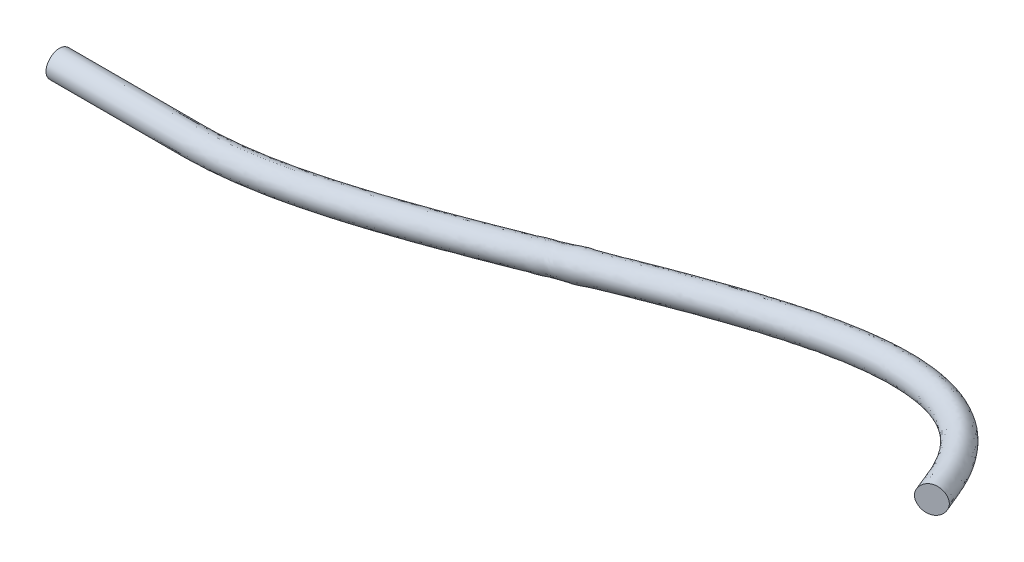
ISO-10303-21;
HEADER;
FILE_DESCRIPTION(('STEP AP214'),'2;1');
FILE_NAME('part.step','',(''),(''),'','','');
FILE_SCHEMA(('AUTOMOTIVE_DESIGN { 1 0 10303 214 1 1 1 1 }'));
ENDSEC;
DATA;
#1=APPLICATION_CONTEXT('core data for automotive mechanical design processes');
#2=APPLICATION_PROTOCOL_DEFINITION('international standard','automotive_design',2000,#1);
#3=PRODUCT_CONTEXT('',#1,'mechanical');
#4=PRODUCT('Part','Part','',(#3));
#5=PRODUCT_RELATED_PRODUCT_CATEGORY('part','',(#4));
#6=PRODUCT_DEFINITION_FORMATION('','',#4);
#7=PRODUCT_DEFINITION_CONTEXT('part definition',#1,'design');
#8=PRODUCT_DEFINITION('design','',#6,#7);
#9=PRODUCT_DEFINITION_SHAPE('','',#8);
#10=(LENGTH_UNIT() NAMED_UNIT(*) SI_UNIT(.MILLI.,.METRE.));
#11=(NAMED_UNIT(*) PLANE_ANGLE_UNIT() SI_UNIT($,.RADIAN.));
#12=(NAMED_UNIT(*) SI_UNIT($,.STERADIAN.) SOLID_ANGLE_UNIT());
#13=UNCERTAINTY_MEASURE_WITH_UNIT(LENGTH_MEASURE(1.E-05),#10,'distance_accuracy_value','');
#14=(GEOMETRIC_REPRESENTATION_CONTEXT(3) GLOBAL_UNCERTAINTY_ASSIGNED_CONTEXT((#13)) GLOBAL_UNIT_ASSIGNED_CONTEXT((#10,
#11,#12)) REPRESENTATION_CONTEXT('',''));
#15=CARTESIAN_POINT('',(0.,0.,0.));
#16=DIRECTION('',(0.,0.,1.));
#17=DIRECTION('',(1.,0.,0.));
#18=AXIS2_PLACEMENT_3D('',#15,#16,#17);
#19=CARTESIAN_POINT('',(-82.6299399470832,0.,-8.));
#20=DIRECTION('',(1.,0.,0.));
#21=DIRECTION('',(0.,0.,-1.));
#22=AXIS2_PLACEMENT_3D('',#19,#20,#21);
#23=PLANE('',#22);
#24=CARTESIAN_POINT('',(-82.6299399470832,1.24999999999999,-8.));
#25=CARTESIAN_POINT('',(-82.6299399470832,1.24999451104967,-7.934263445998));
#26=CARTESIAN_POINT('',(-82.6299399470832,1.24394757093799,-7.86843978532755));
#27=CARTESIAN_POINT('',(-82.6299399470832,1.22054770115747,-7.73875269022428));
#28=CARTESIAN_POINT('',(-82.6299399470832,1.20316461418978,-7.67489496159666));
#29=CARTESIAN_POINT('',(-82.6299399470832,1.15846921996212,-7.55120616587918));
#30=CARTESIAN_POINT('',(-82.6299399470832,1.13121529819942,-7.49135382383757));
#31=CARTESIAN_POINT('',(-82.6299399470832,1.06805297644656,-7.37647331966041));
#32=CARTESIAN_POINT('',(-82.6299399470832,1.03214728036355,-7.32144365762356));
#33=CARTESIAN_POINT('',(-82.6299399470832,0.948477668569165,-7.21142859876297));
#34=CARTESIAN_POINT('',(-82.6299399470832,0.899848374441609,-7.15710012899909));
#35=CARTESIAN_POINT('',(-82.6299399470832,0.794666340037271,-7.05674302691352));
#36=CARTESIAN_POINT('',(-82.6299399470832,0.7381121943317,-7.01071587010256));
#37=CARTESIAN_POINT('',(-82.6299399470832,0.614504613297751,-6.92574363106526));
#38=CARTESIAN_POINT('',(-82.6299399470832,0.547013815945937,-6.88742881801773));
#39=CARTESIAN_POINT('',(-82.6299399470832,0.406202269758556,-6.82377361348313));
#40=CARTESIAN_POINT('',(-82.6299399470832,0.332888504250432,-6.79841794399412));
#41=CARTESIAN_POINT('',(-82.6299399470832,0.188529507754825,-6.76413916117621));
#42=CARTESIAN_POINT('',(-82.6299399470832,0.117763565612033,-6.75407485213505));
#43=CARTESIAN_POINT('',(-82.6299399470832,0.0112594270703022,-6.74947851287114));
#44=CARTESIAN_POINT('',(-82.6299399470832,-0.0243064185035648,-6.74969722601773));
#45=CARTESIAN_POINT('',(-82.6299399470832,-0.0952474387330563,-6.75360385843807));
#46=CARTESIAN_POINT('',(-82.6299399470832,-0.130622610620301,-6.75729182794601));
#47=CARTESIAN_POINT('',(-82.6299399470832,-0.227246675883381,-6.77202546039026));
#48=CARTESIAN_POINT('',(-82.6299399470832,-0.287995438922519,-6.78651537263959));
#49=CARTESIAN_POINT('',(-82.6299399470832,-0.406494949751201,-6.82471336535006));
#50=CARTESIAN_POINT('',(-82.6299399470832,-0.464243700938894,-6.84842749793658));
#51=CARTESIAN_POINT('',(-82.6299399470832,-0.580107662982173,-6.90617945028038));
#52=CARTESIAN_POINT('',(-82.6299399470832,-0.637888674449695,-6.94088689234426));
#53=CARTESIAN_POINT('',(-82.6299399470832,-0.747643557595564,-7.0184851145213));
#54=CARTESIAN_POINT('',(-82.6299399470832,-0.799615981007491,-7.06137792832326));
#55=CARTESIAN_POINT('',(-82.6299399470832,-0.902666862391156,-7.15988937616232));
#56=CARTESIAN_POINT('',(-82.6299399470832,-0.952879103379935,-7.21641933669692));
#57=CARTESIAN_POINT('',(-82.6299399470832,-1.04333787829117,-7.33706089542942));
#58=CARTESIAN_POINT('',(-82.6299399470832,-1.08357285603768,-7.40118115933771));
#59=CARTESIAN_POINT('',(-82.6299399470832,-1.1526842444095,-7.53641454182478));
#60=CARTESIAN_POINT('',(-82.6299399470832,-1.18141371043898,-7.60760447411582));
#61=CARTESIAN_POINT('',(-82.6299399470832,-1.21384481273303,-7.71731529623764));
#62=CARTESIAN_POINT('',(-82.6299399470832,-1.22287305316677,-7.75432217075763));
#63=CARTESIAN_POINT('',(-82.6299399470832,-1.23718702602298,-7.8290422018503));
#64=CARTESIAN_POINT('',(-82.6299399470832,-1.24247612133089,-7.86675469239093));
#65=CARTESIAN_POINT('',(-82.6299399470832,-1.24767209857493,-7.92587702995989));
#66=CARTESIAN_POINT('',(-82.6299399470832,-1.24892231043038,-7.94717897562707));
#67=CARTESIAN_POINT('',(-82.6299399470832,-1.25048636683131,-8.00107627368345));
#68=CARTESIAN_POINT('',(-82.6299399470832,-1.24995845079837,-8.03370175854709));
#69=CARTESIAN_POINT('',(-82.6299399470832,-1.24598903524944,-8.09878128897267));
#70=CARTESIAN_POINT('',(-82.6299399470832,-1.24254568787251,-8.13123521266514));
#71=CARTESIAN_POINT('',(-82.6299399470832,-1.22797265850684,-8.22811692438643));
#72=CARTESIAN_POINT('',(-82.6299399470832,-1.21259724132503,-8.29194935427683));
#73=CARTESIAN_POINT('',(-82.6299399470832,-1.17184541654786,-8.4158326725357));
#74=CARTESIAN_POINT('',(-82.6299399470832,-1.14652834432506,-8.47590358879103));
#75=CARTESIAN_POINT('',(-82.6299399470832,-1.08716532643699,-8.59150617962943));
#76=CARTESIAN_POINT('',(-82.6299399470832,-1.05312277209196,-8.64703960675751));
#77=CARTESIAN_POINT('',(-82.6299399470832,-0.973392709346968,-8.75827792740005));
#78=CARTESIAN_POINT('',(-82.6299399470832,-0.926851008522067,-8.81337087903084));
#79=CARTESIAN_POINT('',(-82.6299399470832,-0.825780898101187,-8.91567364115991));
#80=CARTESIAN_POINT('',(-82.6299399470832,-0.771250375430304,-8.96288135889058));
#81=CARTESIAN_POINT('',(-82.6299399470832,-0.651061071680257,-9.0512823600046));
#82=CARTESIAN_POINT('',(-82.6299399470832,-0.584876109509526,-9.09176649095456));
#83=CARTESIAN_POINT('',(-82.6299399470832,-0.446316510741809,-9.16016458558048));
#84=CARTESIAN_POINT('',(-82.6299399470832,-0.373947149962019,-9.18808913873786));
#85=CARTESIAN_POINT('',(-82.6299399470832,-0.229997495672789,-9.22791910991847));
#86=CARTESIAN_POINT('',(-82.6299399470832,-0.158685599411071,-9.24076747249703));
#87=CARTESIAN_POINT('',(-82.6299399470832,-0.0509714093887163,-9.2493928006905));
#88=CARTESIAN_POINT('',(-82.6299399470832,-0.0149420274589847,-9.25049334386473));
#89=CARTESIAN_POINT('',(-82.6299399470832,0.0570464947861916,-9.24909641718269));
#90=CARTESIAN_POINT('',(-82.6299399470832,0.0930056383961135,-9.24659912034591));
#91=CARTESIAN_POINT('',(-82.6299399470832,0.190865207567188,-9.23499950409096));
#92=CARTESIAN_POINT('',(-82.6299399470832,0.252375177695036,-9.22238819569572));
#93=CARTESIAN_POINT('',(-82.6299399470832,0.372618660830394,-9.1876324322482));
#94=CARTESIAN_POINT('',(-82.6299399470832,0.431350040636321,-9.16548078051185));
#95=CARTESIAN_POINT('',(-82.6299399470832,0.548309093036346,-9.11118017114085));
#96=CARTESIAN_POINT('',(-82.6299399470832,0.606294201026917,-9.07851023861039));
#97=CARTESIAN_POINT('',(-82.6299399470832,0.716782227147695,-9.00497270761376));
#98=CARTESIAN_POINT('',(-82.6299399470832,0.769284126532467,-8.96410358989634));
#99=CARTESIAN_POINT('',(-82.6299399470832,0.874110904698241,-8.86962192185421));
#100=CARTESIAN_POINT('',(-82.6299399470832,0.925576562838173,-8.81505192123485));
#101=CARTESIAN_POINT('',(-82.6299399470832,1.01899120100739,-8.69817964883807));
#102=CARTESIAN_POINT('',(-82.6299399470832,1.06092922861801,-8.63586860435206));
#103=CARTESIAN_POINT('',(-82.6299399470832,1.13449301587409,-8.50327539966568));
#104=CARTESIAN_POINT('',(-82.6299399470832,1.16582552688828,-8.43282933746418));
#105=CARTESIAN_POINT('',(-82.6299399470832,1.21449053501966,-8.28738644572588));
#106=CARTESIAN_POINT('',(-82.6299399470832,1.23187536123434,-8.21240777174639));
#107=CARTESIAN_POINT('',(-82.6299399470832,1.24425522575055,-8.11391843014801));
#108=CARTESIAN_POINT('',(-82.6299399470832,1.24640193487613,-8.09119081010386));
#109=CARTESIAN_POINT('',(-82.6299399470832,1.2492752517605,-8.0456456262251));
#110=CARTESIAN_POINT('',(-82.6299399470832,1.25000190612542,-8.02282806536697));
#111=CARTESIAN_POINT('',(-82.6299399470832,1.24999999999999,-8.));
#112=B_SPLINE_CURVE_WITH_KNOTS('',3,(#24,#25,#26,#27,#28,#29,#30,#31,#32,#33,#34,#35,#36,#37,
#38,#39,#40,#41,#42,#43,#44,#45,#46,#47,#48,#49,#50,#51,#52,#53,#54,#55,#56,#57,#58,#59,#60,#61,
#62,#63,#64,#65,#66,#67,#68,#69,#70,#71,#72,#73,#74,#75,#76,#77,#78,#79,#80,#81,#82,#83,#84,#85,
#86,#87,#88,#89,#90,#91,#92,#93,#94,#95,#96,#97,#98,#99,#100,#101,#102,#103,#104,#105,#106,#107,
#108,#109,#110,#111),.UNSPECIFIED.,.T.,.F.,(4,2,2,2,2,2,2,2,2,2,2,2,2,2,2,2,2,2,2,2,2,2,2,2,2,2,
2,2,2,2,2,2,2,2,2,2,2,2,2,2,2,2,2,4),(0.,0.197116879760725,0.394760296143589,0.591253259525333,
0.78768489315266,1.00549973727618,1.22335325866559,1.4549555018158,1.68628406722216,
1.89931405653623,2.00586042536824,2.11240833699586,2.29889416315246,2.4855025519213,
2.68691126080963,2.88837007581244,3.11416228610467,3.34021481159209,3.5690687754045,
3.68319318615433,3.7972148254841,3.86120286479425,3.95894310699971,4.05674534541567,
4.25269104555643,4.44748462437225,4.64220260755968,4.85766355141401,5.07318158877794,
5.30474023035866,5.53610326792274,5.75205882159631,5.86003814673477,5.96801227933965,
6.1554726305271,6.3430746393393,6.54195533500427,6.74087291595324,6.96490444465314,
7.1891922185423,7.41925360779743,7.64844775970474,7.71690198239458,7.78535395838307),.UNSPECIFIED.);
#113=CARTESIAN_POINT('',(-82.6299399470832,1.24999999999999,-8.));
#114=VERTEX_POINT('',#113);
#115=EDGE_CURVE('E28',#114,#114,#112,.T.);
#116=ORIENTED_EDGE('',*,*,#115,.F.);
#117=EDGE_LOOP('',(#116));
#118=FACE_BOUND('',#117,.T.);
#119=ADVANCED_FACE('F15',(#118),#23,.F.);
#120=CARTESIAN_POINT('',(-4.97488462074198,1.5,-12.0104339226486));
#121=DIRECTION('',(0.382683432365065,0.,0.923879532511297));
#122=DIRECTION('',(0.923879532511297,0.,-0.382683432365065));
#123=AXIS2_PLACEMENT_3D('',#120,#121,#122);
#124=PLANE('',#123);
#125=CARTESIAN_POINT('',(-4.96027339280794,2.74989081560263,-12.0164860914218));
#126=CARTESIAN_POINT('',(-4.89976415622547,2.74914926909641,-12.0415498378631));
#127=CARTESIAN_POINT('',(-4.839239547017,2.74241022652978,-12.0666199518546));
#128=CARTESIAN_POINT('',(-4.72008853566718,2.71767071582545,-12.1159739167262));
#129=CARTESIAN_POINT('',(-4.66146836227079,2.69963657665579,-12.1402551875756));
#130=CARTESIAN_POINT('',(-4.5480503043085,2.65370613180203,-12.1872344854016));
#131=CARTESIAN_POINT('',(-4.49323185547633,2.62586881235953,-12.2099410303761));
#132=CARTESIAN_POINT('',(-4.38813525175894,2.56162062563925,-12.2534734689952));
#133=CARTESIAN_POINT('',(-4.33785533947212,2.52521309677129,-12.2743000905794));
#134=CARTESIAN_POINT('',(-4.23748709669935,2.44061810372065,-12.3158739779674));
#135=CARTESIAN_POINT('',(-4.18800813721481,2.3915822812109,-12.336368834038));
#136=CARTESIAN_POINT('',(-4.09673150553609,2.28574455131122,-12.3741768528071));
#137=CARTESIAN_POINT('',(-4.05493546617023,2.22894099753142,-12.3914893391659));
#138=CARTESIAN_POINT('',(-3.97772493911392,2.10473128572356,-12.4234709866306));
#139=CARTESIAN_POINT('',(-3.94293211903832,2.03686814615665,-12.4378826445791));
#140=CARTESIAN_POINT('',(-3.88531365016109,1.89545702002494,-12.4617489958312));
#141=CARTESIAN_POINT('',(-3.86247539271455,1.82191511728978,-12.4712089118065));
#142=CARTESIAN_POINT('',(-3.83181062449372,1.67689646049935,-12.4839106746906));
#143=CARTESIAN_POINT('',(-3.8229937809974,1.60567304607789,-12.4875627308441));
#144=CARTESIAN_POINT('',(-3.81953605474406,1.4985693450428,-12.4889949679532));
#145=CARTESIAN_POINT('',(-3.82001190113379,1.4628200107549,-12.488797865925));
#146=CARTESIAN_POINT('',(-3.82421343937108,1.39154570024958,-12.4870575318043));
#147=CARTESIAN_POINT('',(-3.82793910585535,1.35602072228334,-12.4855143102176));
#148=CARTESIAN_POINT('',(-3.84245212693226,1.25925414384471,-12.4795028200566));
#149=CARTESIAN_POINT('',(-3.85643133536663,1.19854817552451,-12.4737124423318));
#150=CARTESIAN_POINT('',(-3.8929507006491,1.08025708794606,-12.4585856259426));
#151=CARTESIAN_POINT('',(-3.91549680721039,1.02267416947951,-12.4492467228262));
#152=CARTESIAN_POINT('',(-3.97000496774041,0.907682948482515,-12.4266687034746));
#153=CARTESIAN_POINT('',(-4.00252940912379,0.850587541275613,-12.413196638745));
#154=CARTESIAN_POINT('',(-4.07502603025172,0.742258466378721,-12.3831675550476));
#155=CARTESIAN_POINT('',(-4.11499993027247,0.691026157052202,-12.3666098235181));
#156=CARTESIAN_POINT('',(-4.20670082780987,0.589455267965675,-12.3286260680763));
#157=CARTESIAN_POINT('',(-4.25926873248316,0.540002001086894,-12.3068517290151));
#158=CARTESIAN_POINT('',(-4.3712733173156,0.451056907458015,-12.2604579109295));
#159=CARTESIAN_POINT('',(-4.43071761313479,0.411576282506383,-12.2358352773955));
#160=CARTESIAN_POINT('',(-4.55614458660073,0.343743432986418,-12.1838817238985));
#161=CARTESIAN_POINT('',(-4.62222350219324,0.315598105526852,-12.1565109408732));
#162=CARTESIAN_POINT('',(-4.75801547109453,0.273549970128643,-12.1002640656929));
#163=CARTESIAN_POINT('',(-4.82771294265216,0.25959068305705,-12.0713944277106));
#164=CARTESIAN_POINT('',(-4.91495356656513,0.252047485025046,-12.035258178096));
#165=CARTESIAN_POINT('',(-4.9320708764728,0.251038299865113,-12.0281679561809));
#166=CARTESIAN_POINT('',(-4.96633119090965,0.249962288201005,-12.01397686929));
#167=CARTESIAN_POINT('',(-4.98347419525295,0.249895454912508,-12.0068760043912));
#168=CARTESIAN_POINT('',(-5.06132153022488,0.251779511361305,-11.9746305824512));
#169=CARTESIAN_POINT('',(-5.12199357420015,0.259290834238215,-11.9494993989797));
#170=CARTESIAN_POINT('',(-5.24130052452541,0.285572752485075,-11.9000808420697));
#171=CARTESIAN_POINT('',(-5.29992914637272,0.304375309165862,-11.8757960717573));
#172=CARTESIAN_POINT('',(-5.4132598002729,0.351817854368603,-11.8288529778792));
#173=CARTESIAN_POINT('',(-5.46798290594936,0.38039931040431,-11.8061859253328));
#174=CARTESIAN_POINT('',(-5.57279216570636,0.446105883037905,-11.7627725084792));
#175=CARTESIAN_POINT('',(-5.62287997119789,0.483227940330179,-11.7420254601351));
#176=CARTESIAN_POINT('',(-5.72277201442856,0.569326945947953,-11.7006488210558));
#177=CARTESIAN_POINT('',(-5.77195155591433,0.619154590947568,-11.6802779879811));
#178=CARTESIAN_POINT('',(-5.86248138436063,0.726546450568742,-11.6427793052393));
#179=CARTESIAN_POINT('',(-5.90383027715104,0.784112039741792,-11.6256520330564));
#180=CARTESIAN_POINT('',(-5.97977063083461,0.909582181702379,-11.5941965086293));
#181=CARTESIAN_POINT('',(-6.01377093126964,0.977909953075727,-11.5801131230644));
#182=CARTESIAN_POINT('',(-6.06966760774206,1.12010478247088,-11.5569599615779));
#183=CARTESIAN_POINT('',(-6.09157826611371,1.19396518668885,-11.5478842697198));
#184=CARTESIAN_POINT('',(-6.12026838914593,1.33905196747036,-11.5360004316537));
#185=CARTESIAN_POINT('',(-6.12810765603747,1.4100245529746,-11.5327533009882));
#186=CARTESIAN_POINT('',(-6.13016080863225,1.51660464942211,-11.5319028573378));
#187=CARTESIAN_POINT('',(-6.12922671417907,1.55215680432518,-11.5322897719289));
#188=CARTESIAN_POINT('',(-6.12415811515207,1.62299319738925,-11.5343892543881));
#189=CARTESIAN_POINT('',(-6.12002356423298,1.65827743166306,-11.5361018414531));
#190=CARTESIAN_POINT('',(-6.10442593819459,1.75454931541005,-11.542562589699));
#191=CARTESIAN_POINT('',(-6.0897918686002,1.81496022027623,-11.5486242197977));
#192=CARTESIAN_POINT('',(-6.05207109644876,1.93257926857484,-11.564248675206));
#193=CARTESIAN_POINT('',(-6.02897885998411,1.98978528683644,-11.5738137927352));
#194=CARTESIAN_POINT('',(-5.97325147717589,2.10433349391368,-11.5968968304899));
#195=CARTESIAN_POINT('',(-5.94000474210711,2.16132666365742,-11.61066807906));
#196=CARTESIAN_POINT('',(-5.86607201365744,2.26932548242332,-11.6412920178871));
#197=CARTESIAN_POINT('',(-5.82538411062953,2.32032958892599,-11.6581454991458));
#198=CARTESIAN_POINT('',(-5.73227176818824,2.4211612055126,-11.6967138942093));
#199=CARTESIAN_POINT('',(-5.67902329712082,2.47010228416397,-11.7187701331011));
#200=CARTESIAN_POINT('',(-5.56573044703065,2.55785040881986,-11.7656975681283));
#201=CARTESIAN_POINT('',(-5.50567853840328,2.59664606635605,-11.7905718831282));
#202=CARTESIAN_POINT('',(-5.37935292571082,2.66272449400189,-11.8428976651805));
#203=CARTESIAN_POINT('',(-5.31301156423653,2.68985922194648,-11.8703771568494));
#204=CARTESIAN_POINT('',(-5.21101338491705,2.71983854012591,-11.9126261860609));
#205=CARTESIAN_POINT('',(-5.17664535724554,2.72804083395768,-11.9268618892345));
#206=CARTESIAN_POINT('',(-5.10733158257879,2.74068757282284,-11.9555725947607));
#207=CARTESIAN_POINT('',(-5.07238632828716,2.74513506934826,-11.9700473930289));
#208=CARTESIAN_POINT('',(-5.01168646982198,2.74943834004976,-11.9951900976393));
#209=CARTESIAN_POINT('',(-4.98598131873767,2.75020586870414,-12.0058375198412));
#210=CARTESIAN_POINT('',(-4.96027339280794,2.74989081560263,-12.0164860914218));
#211=B_SPLINE_CURVE_WITH_KNOTS('',3,(#125,#126,#127,#128,#129,#130,#131,#132,#133,#134,#135,
#136,#137,#138,#139,#140,#141,#142,#143,#144,#145,#146,#147,#148,#149,#150,#151,#152,#153,#154,
#155,#156,#157,#158,#159,#160,#161,#162,#163,#164,#165,#166,#167,#168,#169,#170,#171,#172,#173,
#174,#175,#176,#177,#178,#179,#180,#181,#182,#183,#184,#185,#186,#187,#188,#189,#190,#191,#192,
#193,#194,#195,#196,#197,#198,#199,#200,#201,#202,#203,#204,#205,#206,#207,#208,#209,#210),
.UNSPECIFIED.,.T.,.F.,(4,2,2,2,2,2,2,2,2,2,2,2,2,2,2,2,2,2,2,2,2,2,2,2,2,2,2,2,2,2,2,2,2,2,2,2,
2,2,2,2,2,2,4),(0.,0.196397578991343,0.393383430196831,0.589203708083759,0.784947832675607,
1.00187152193737,1.21884126018193,1.45046511010116,1.681844168332,1.89601108021464,
2.0031144603967,2.11021700469568,2.29702137692428,2.48395572267383,2.6843893154749,
2.88486925115563,3.11001253414754,3.33540759652621,3.56474813837072,3.79317198263352,
3.84882207068081,3.90447175808329,4.10157162661478,4.29923205936699,4.49572949614903,
4.69215665540574,4.90997146645888,5.12782502091781,5.35942752383239,5.59075582958414,
5.8037857562943,5.91033215647891,6.01688009957302,6.20336609181688,6.38997431445435,
6.59138219617579,6.79284183846234,7.01863801477581,7.24468657494353,7.47352576167356,
7.58765261845514,7.70168663577659,7.78512801925206),.UNSPECIFIED.);
#212=CARTESIAN_POINT('',(-4.96027339280794,2.74989081560263,-12.0164860914218));
#213=VERTEX_POINT('',#212);
#214=EDGE_CURVE('E10',#213,#213,#211,.T.);
#215=ORIENTED_EDGE('',*,*,#214,.F.);
#216=EDGE_LOOP('',(#215));
#217=FACE_BOUND('',#216,.T.);
#218=ADVANCED_FACE('F36',(#217),#124,.T.);
#219=CARTESIAN_POINT('',(-82.6299399470832,1.24999999999999,-8.));
#220=CARTESIAN_POINT('',(-78.4673130379324,1.24999999999999,-8.));
#221=CARTESIAN_POINT('',(-74.1429598139041,1.24999784413656,-8.00170386651195));
#222=CARTESIAN_POINT('',(-64.5499802448411,1.25000299765051,-7.99763083493473));
#223=CARTESIAN_POINT('',(-58.32276354188,1.34931283873836,-9.68253438955358));
#224=CARTESIAN_POINT('',(-50.3254511622084,1.52256147322456,-12.243982642926));
#225=CARTESIAN_POINT('',(-48.7182612785638,1.56182502129807,-12.7870872204025));
#226=CARTESIAN_POINT('',(-46.2781720158321,1.60922003642585,-13.5372494840847));
#227=CARTESIAN_POINT('',(-45.4677031631818,1.63862504790368,-13.7969954784039));
#228=CARTESIAN_POINT('',(-44.1762331975424,1.58362935185705,-13.9796088930681));
#229=CARTESIAN_POINT('',(-43.7292604588893,1.61767208159078,-13.9900739999033));
#230=CARTESIAN_POINT('',(-42.9594433142138,1.11213015310007,-13.7695942287284));
#231=CARTESIAN_POINT('',(-42.6859372215601,0.744156978901234,-13.6638184209571));
#232=CARTESIAN_POINT('',(-42.2907018019852,-0.0292629482295288,-13.8762720028818));
#233=CARTESIAN_POINT('',(-42.1530435971104,-0.283201742010382,-14.1388344441783));
#234=CARTESIAN_POINT('',(-41.3640803369761,-0.908158093879505,-15.1209385778716));
#235=CARTESIAN_POINT('',(-40.5760269401968,-0.678438105024769,-15.4077877376587));
#236=CARTESIAN_POINT('',(-39.0358514318827,-0.663161966181277,-16.0877630210618));
#237=CARTESIAN_POINT('',(-38.2569731412143,-0.643369177418067,-16.3889764199555));
#238=CARTESIAN_POINT('',(-35.930369349776,-0.584139893720942,-17.2644087558491));
#239=CARTESIAN_POINT('',(-34.3890589289272,-0.538835001947949,-17.7998471070783));
#240=CARTESIAN_POINT('',(-26.8203196817,-0.314260161888173,-20.2780073639864));
#241=CARTESIAN_POINT('',(-21.1423642902392,-0.128817369778011,-21.6267168256903));
#242=CARTESIAN_POINT('',(-14.0504123208268,0.0819660689236484,-21.1327818241657));
#243=CARTESIAN_POINT('',(-11.9244313728403,0.141323746897592,-20.5428117137421));
#244=CARTESIAN_POINT('',(-8.31951094026181,0.225381060992211,-18.1871627239197));
#245=CARTESIAN_POINT('',(-6.83323165674978,0.250319048288096,-16.4227931876634));
#246=CARTESIAN_POINT('',(-5.5203653280615,0.250308263514492,-13.2548680971591));
#247=CARTESIAN_POINT('',(-5.25533503430871,0.250310281170427,-12.6147263010424));
#248=CARTESIAN_POINT('',(-5.00061440284024,0.250310281170211,-11.9997762979466));
#249=CARTESIAN_POINT('',(-82.6299399470832,1.24999999999999,-7.34550153050212));
#250=CARTESIAN_POINT('',(-78.4307901746025,1.24999999999999,-7.34550153050212));
#251=CARTESIAN_POINT('',(-74.1915887344148,1.25090933391794,-7.3472044975582));
#252=CARTESIAN_POINT('',(-64.482363480953,1.24873560391265,-7.34313361609789));
#253=CARTESIAN_POINT('',(-58.1417044323906,1.35398436871358,-9.05226932167524));
#254=CARTESIAN_POINT('',(-50.1136840509845,1.48816690381801,-11.6255618089751));
#255=CARTESIAN_POINT('',(-48.501882071257,1.52077889097471,-12.1696153960085));
#256=CARTESIAN_POINT('',(-46.0587338924115,1.51257273902406,-12.9279659338611));
#257=CARTESIAN_POINT('',(-45.24541379231,1.52728295525352,-13.1838202651168));
#258=CARTESIAN_POINT('',(-43.9651448247779,1.33395731080393,-13.410548162771));
#259=CARTESIAN_POINT('',(-43.5120689771814,1.29399181982901,-13.4101629823077));
#260=CARTESIAN_POINT('',(-42.8287359567967,0.543438836933819,-13.4489054983599));
#261=CARTESIAN_POINT('',(-42.618998389974,0.0748890251134603,-13.5280056983189));
#262=CARTESIAN_POINT('',(-42.3635888464237,-0.663953097500539,-14.1266747361293));
#263=CARTESIAN_POINT('',(-42.2743953188778,-0.812977162628285,-14.5161691536623));
#264=CARTESIAN_POINT('',(-41.6090102471717,-1.09400221281749,-15.8168297006204));
#265=CARTESIAN_POINT('',(-40.7835870867088,-0.862373959682668,-16.0015553024204));
#266=CARTESIAN_POINT('',(-39.2481680999386,-0.782415061811523,-16.6961821752883));
#267=CARTESIAN_POINT('',(-38.4686915774094,-0.749858219550985,-16.9991580261462));
#268=CARTESIAN_POINT('',(-36.1389895901971,-0.658764375190916,-17.8806464226742));
#269=CARTESIAN_POINT('',(-34.5926845868728,-0.606625304249534,-18.4182350459236));
#270=CARTESIAN_POINT('',(-26.9890745454449,-0.351328831349457,-20.9104828466961));
#271=CARTESIAN_POINT('',(-21.2573288286086,-0.166746798737893,-22.2901154064621));
#272=CARTESIAN_POINT('',(-13.9225468809217,0.0545997834607554,-21.7792073737249));
#273=CARTESIAN_POINT('',(-11.6795237396379,0.117993772080195,-21.1643141930278));
#274=CARTESIAN_POINT('',(-7.84748930868401,0.20851269929624,-18.6601324961522));
#275=CARTESIAN_POINT('',(-6.24968259868227,0.235495762936977,-16.7238251832281));
#276=CARTESIAN_POINT('',(-4.91100969330965,0.235781698068551,-13.4936200659266));
#277=CARTESIAN_POINT('',(-4.65443234329321,0.23572820425566,-12.8738812604926));
#278=CARTESIAN_POINT('',(-4.39608675890461,0.235728204255441,-12.2501798468942));
#279=CARTESIAN_POINT('',(-82.6299399470832,0.654498469497868,-6.75));
#280=CARTESIAN_POINT('',(-78.3956253974687,0.654498469497179,-6.75));
#281=CARTESIAN_POINT('',(-74.2384094104545,0.65623712782756,-6.75087272597686));
#282=CARTESIAN_POINT('',(-64.4172610159258,0.652080927662139,-6.74878650593727));
#283=CARTESIAN_POINT('',(-57.9648827033473,0.762151473410816,-8.4778146361595));
#284=CARTESIAN_POINT('',(-49.9186826669691,0.862294967682176,-11.0967463315393));
#285=CARTESIAN_POINT('',(-48.3043449442196,0.888288247048973,-11.6475962816589));
#286=CARTESIAN_POINT('',(-45.8752388870319,0.835592277084756,-12.4612192491517));
#287=CARTESIAN_POINT('',(-45.0636187535443,0.832728425284576,-12.726224750739));
#288=CARTESIAN_POINT('',(-43.8369826065098,0.55475205061938,-13.1112841058076));
#289=CARTESIAN_POINT('',(-43.4008375845456,0.436285341035767,-13.16452774559));
#290=CARTESIAN_POINT('',(-42.8775809574828,-0.288703988543581,-13.6468390923137));
#291=CARTESIAN_POINT('',(-42.7610991487451,-0.670900757271206,-13.9787586127489));
#292=CARTESIAN_POINT('',(-42.6312019225728,-1.00468099895085,-14.8959998842968));
#293=CARTESIAN_POINT('',(-42.5567480408878,-0.934688688542331,-15.3100666859237));
#294=CARTESIAN_POINT('',(-41.9053385191164,-0.592095079563951,-16.6033279924198));
#295=CARTESIAN_POINT('',(-41.0430293943172,-0.457642801065943,-16.694343643662));
#296=CARTESIAN_POINT('',(-39.4924352202645,-0.304823502054097,-17.3468074023472));
#297=CARTESIAN_POINT('',(-38.7085430399966,-0.259323375349674,-17.6404719698252));
#298=CARTESIAN_POINT('',(-36.3663415787429,-0.134955674642618,-18.5002834207619));
#299=CARTESIAN_POINT('',(-34.8133479583629,-0.0762216999150894,-19.0341385255107));
#300=CARTESIAN_POINT('',(-27.1679400241455,0.209636060522251,-21.5141232997661));
#301=CARTESIAN_POINT('',(-21.3859931081699,0.392967353472692,-22.9256250580611));
#302=CARTESIAN_POINT('',(-13.8176237041881,0.624451134584883,-22.3953408089882));
#303=CARTESIAN_POINT('',(-11.4621320002167,0.691717198331678,-21.755840434451));
#304=CARTESIAN_POINT('',(-7.41200702325386,0.788428476045155,-19.1077639326673));
#305=CARTESIAN_POINT('',(-5.70738533222572,0.817357478005418,-17.0055644378087));
#306=CARTESIAN_POINT('',(-4.34411513013242,0.817919405352926,-13.7152916981385));
#307=CARTESIAN_POINT('',(-4.0956296965825,0.81781427788456,-13.1152165650715));
#308=CARTESIAN_POINT('',(-3.8337939499284,0.81781427788456,-12.483089154397));
#309=CARTESIAN_POINT('',(-82.6299399470832,-0.65449846949788,-6.75));
#310=CARTESIAN_POINT('',(-78.3913739497811,-0.654498469498569,-6.75));
#311=CARTESIAN_POINT('',(-74.2440700649816,-0.652759817891534,-6.74904953708328));
#312=CARTESIAN_POINT('',(-64.4093900795243,-0.656916001985037,-6.75132158447996));
#313=CARTESIAN_POINT('',(-57.9383216490592,-0.548124344336898,-8.47561178741372));
#314=CARTESIAN_POINT('',(-49.9135761526735,-0.444671297381288,-11.1711764760235));
#315=CARTESIAN_POINT('',(-48.3028886987352,-0.419923755912634,-11.7350677783494));
#316=CARTESIAN_POINT('',(-45.9107670515466,-0.459212330293704,-12.6538108478148));
#317=CARTESIAN_POINT('',(-45.1085861809796,-0.47131688904939,-12.946715247601));
#318=CARTESIAN_POINT('',(-43.9774405943007,-0.658707694278701,-13.5915806667945));
#319=CARTESIAN_POINT('',(-43.590718149517,-0.801714789929935,-13.7844086446075));
#320=CARTESIAN_POINT('',(-43.2463639209457,-0.980489470084588,-14.7233027036963));
#321=CARTESIAN_POINT('',(-43.2073344612909,-0.971716710726683,-15.2412029812529));
#322=CARTESIAN_POINT('',(-43.0736793822914,-0.484269019017795,-16.0862803553887));
#323=CARTESIAN_POINT('',(-42.9346959809354,-0.142677067109551,-16.3004967946261));
#324=CARTESIAN_POINT('',(-42.0668503258859,0.882856319592675,-16.9403806931956));
#325=CARTESIAN_POINT('',(-41.1982001402363,0.799885476048924,-17.0296556801164));
#326=CARTESIAN_POINT('',(-39.6047357061654,0.983496766569752,-17.5601357467524));
#327=CARTESIAN_POINT('',(-38.8123337468213,1.03191996373214,-17.8298078870284));
#328=CARTESIAN_POINT('',(-36.4488530579332,1.16569920501949,-18.6298582116397));
#329=CARTESIAN_POINT('',(-34.8911460722479,1.22526135655975,-19.1512059684637));
#330=CARTESIAN_POINT('',(-27.2236020220516,1.51685390173394,-21.5760597810141));
#331=CARTESIAN_POINT('',(-21.4388863911235,1.69915741027185,-22.9957683677849));
#332=CARTESIAN_POINT('',(-13.842718540066,1.93179790731572,-22.4568385057249));
#333=CARTESIAN_POINT('',(-11.4740893487161,1.99950272082612,-21.8130941648798));
#334=CARTESIAN_POINT('',(-7.39879837452212,2.09690243814687,-19.1457818596678));
#335=CARTESIAN_POINT('',(-5.68243703797763,2.12601873621145,-17.0228033416872));
#336=CARTESIAN_POINT('',(-4.31671163766783,2.12659389383689,-13.7250534906971));
#337=CARTESIAN_POINT('',(-4.06910749827743,2.12648629119868,-13.1273959208107));
#338=CARTESIAN_POINT('',(-3.80684978512227,2.12648629119868,-12.4942497928865));
#339=CARTESIAN_POINT('',(-82.6299399470832,-1.25000000000001,-7.34550153050212));
#340=CARTESIAN_POINT('',(-78.4226705076083,-1.25000000000001,-7.34550153050212));
#341=CARTESIAN_POINT('',(-74.2023997882268,-1.24909067892229,-7.34372246326296));
#342=CARTESIAN_POINT('',(-64.467331099701,-1.25126437823346,-7.34797525947222));
#343=CARTESIAN_POINT('',(-58.0909765553705,-1.14845810978947,-9.04806219042026));
#344=CARTESIAN_POINT('',(-50.1039313270831,-1.00795479465163,-11.7677129139052));
#345=CARTESIAN_POINT('',(-48.4991008472684,-0.977721991626875,-12.3366736489444));
#346=CARTESIAN_POINT('',(-46.1265876884206,-0.960321904205394,-13.2957887929631));
#347=CARTESIAN_POINT('',(-45.3312952525558,-0.96326013825138,-13.6049260948753));
#348=CARTESIAN_POINT('',(-44.2333998214258,-0.983580088918787,-14.3278470247472));
#349=CARTESIAN_POINT('',(-43.8747141433329,-1.07041426487031,-14.5940482927884));
#350=CARTESIAN_POINT('',(-43.5330595355529,-0.777774110423649,-15.5047995560819));
#351=CARTESIAN_POINT('',(-43.4712450592547,-0.499627126326832,-15.9390968378307));
#352=CARTESIAN_POINT('',(-43.2086585454801,0.329960571106695,-16.399942983809));
#353=CARTESIAN_POINT('',(-42.9962227135547,0.69965361181871,-16.4077513247059));
#354=CARTESIAN_POINT('',(-41.9174750761639,1.72294745913573,-16.4605529415552));
#355=CARTESIAN_POINT('',(-41.0799413815341,1.53932813688533,-16.6419541193771));
#356=CARTESIAN_POINT('',(-39.4626462292618,1.67809540663203,-17.1036093014549));
#357=CARTESIAN_POINT('',(-38.6669172258605,1.71623490224142,-17.3607629916778));
#358=CARTESIAN_POINT('',(-36.2965749075102,1.82530346506662,-18.1281160442961));
#359=CARTESIAN_POINT('',(-34.7412680395559,1.87902423721041,-18.6418173925645));
#360=CARTESIAN_POINT('',(-27.0953811306474,2.14527334217114,-21.0287728125256));
#361=CARTESIAN_POINT('',(-21.3583475579538,2.32789245114605,-22.4240792600495));
#362=CARTESIAN_POINT('',(-13.9704744869923,2.55144819804538,-21.8966593228282));
#363=CARTESIAN_POINT('',(-11.7023605930644,2.6156801369884,-21.2736607635617));
#364=CARTESIAN_POINT('',(-7.82226264785027,2.70751388700243,-18.7327413882155));
#365=CARTESIAN_POINT('',(-6.20203486645482,2.73485465985398,-16.7567490644159));
#366=CARTESIAN_POINT('',(-4.85867287790776,2.73516586295414,-13.5122637163966));
#367=CARTESIAN_POINT('',(-4.60377867574987,2.73510764191459,-12.8971421165265));
#368=CARTESIAN_POINT('',(-4.34462719470808,2.73510764191503,-12.2714950962982));
#369=CARTESIAN_POINT('',(-82.6299399470832,-1.25000000000001,-8.65449846949787));
#370=CARTESIAN_POINT('',(-78.4957162342683,-1.25000000000001,-8.65449846949787));
#371=CARTESIAN_POINT('',(-74.1051419472056,-1.25091365848505,-8.65272120116872));
#372=CARTESIAN_POINT('',(-64.6025646274771,-1.24872959075775,-8.65696969714834));
#373=CARTESIAN_POINT('',(-58.4530947743493,-1.15780116973992,-10.3085923261769));
#374=CARTESIAN_POINT('',(-50.5274655495309,-0.939165655838519,-13.004554581807));
#375=CARTESIAN_POINT('',(-48.931859261882,-0.895629730980341,-13.5716172977325));
#376=CARTESIAN_POINT('',(-46.5654639352616,-0.767027309401718,-14.5143558934103));
#377=CARTESIAN_POINT('',(-45.7758739942994,-0.740575952951055,-14.8312765214496));
#378=CARTESIAN_POINT('',(-44.6555765669548,-0.484236006812553,-15.4659684853415));
#379=CARTESIAN_POINT('',(-44.3090971067487,-0.423053741346772,-15.7538703279795));
#380=CARTESIAN_POINT('',(-43.7944742503872,0.35960852190885,-16.1461770168189));
#381=CARTESIAN_POINT('',(-43.605122722427,0.838908781248716,-16.2107222831071));
#382=CARTESIAN_POINT('',(-43.0628844566031,1.59934086964872,-15.8991375173141));
#383=CARTESIAN_POINT('',(-42.7535192700199,1.75920445305452,-15.653081905738));
#384=CARTESIAN_POINT('',(-41.4276152557727,2.09463569701169,-15.0687706960576));
#385=CARTESIAN_POINT('',(-40.6648210885099,1.90719984620113,-15.4544189898566));
#386=CARTESIAN_POINT('',(-39.03801289315,1.91660159789253,-15.886770992999));
#387=CARTESIAN_POINT('',(-38.2434803534702,1.92921298650734,-16.1403997792964));
#388=CARTESIAN_POINT('',(-35.8793344266681,1.97455242800639,-16.8956407106459));
#389=CARTESIAN_POINT('',(-34.3340167236646,2.01460484181289,-17.405041514874));
#390=CARTESIAN_POINT('',(-26.7578714031576,2.21941068109647,-19.7638218471062));
#391=CARTESIAN_POINT('',(-21.1284184812152,2.40375130906581,-21.097282098506));
#392=CARTESIAN_POINT('',(-14.2262053668026,2.60618076897117,-20.6038082237099));
#393=CARTESIAN_POINT('',(-12.1921758594692,2.66234008662366,-20.0306558049902));
#394=CARTESIAN_POINT('',(-8.76630591100585,2.7412506103939,-17.7868018437505));
#395=CARTESIAN_POINT('',(-7.36913298258986,2.76450123055591,-16.1546850732866));
#396=CARTESIAN_POINT('',(-6.07738414741146,2.76421899384609,-13.0347597788616));
#397=CARTESIAN_POINT('',(-5.80558405778087,2.76427179574457,-12.3788321976262));
#398=CARTESIAN_POINT('',(-5.55368248257935,2.76427179574457,-11.770687998403));
#399=CARTESIAN_POINT('',(-82.6299399470832,-0.65449846949788,-9.25));
#400=CARTESIAN_POINT('',(-78.5308810114021,-0.65449846949788,-9.25));
#401=CARTESIAN_POINT('',(-74.0583212711659,-0.656241452394455,-9.24905297275354));
#402=CARTESIAN_POINT('',(-64.6676670925043,-0.652074914507536,-9.25131680730411));
#403=CARTESIAN_POINT('',(-58.6299165034859,-0.56596827443679,-10.883047011681));
#404=CARTESIAN_POINT('',(-50.7224669335229,-0.313293719702777,-13.5333700592458));
#405=CARTESIAN_POINT('',(-49.1293963889194,-0.263139087055064,-14.093636412088));
#406=CARTESIAN_POINT('',(-46.7489589406412,-0.090046847462184,-14.9811025781167));
#407=CARTESIAN_POINT('',(-45.9576690330769,-0.0460214229821122,-15.2888720358245));
#408=CARTESIAN_POINT('',(-44.7837387852171,0.294969253372,-15.7652325423063));
#409=CARTESIAN_POINT('',(-44.4203284993904,0.43465273744638,-15.9995055646972));
#410=CARTESIAN_POINT('',(-43.7456292496981,1.1917513473863,-15.9482434228651));
#411=CARTESIAN_POINT('',(-43.4630219636544,1.58469856363329,-15.7599693686763));
#412=CARTESIAN_POINT('',(-42.7952713804554,1.94006877109912,-15.1298123691473));
#413=CARTESIAN_POINT('',(-42.47116654801,1.88091597896861,-14.8591843734766));
#414=CARTESIAN_POINT('',(-41.131286983828,1.59272856375798,-14.2822724042582));
#415=CARTESIAN_POINT('',(-40.4053787808957,1.5024686875845,-14.7616306486092));
#416=CARTESIAN_POINT('',(-38.7937457728299,1.43901003813501,-15.2361457659458));
#417=CARTESIAN_POINT('',(-38.0036288908887,1.43867814230603,-15.4990858356174));
#418=CARTESIAN_POINT('',(-35.6519824381107,1.45074372745809,-16.2760037125582));
#419=CARTESIAN_POINT('',(-34.1133533521745,1.48420123747896,-16.7891380352869));
#420=CARTESIAN_POINT('',(-26.579005924457,1.65844578922269,-19.1601813940362));
#421=CARTESIAN_POINT('',(-20.9997542016538,1.84403715685419,-20.4617724469069));
#422=CARTESIAN_POINT('',(-14.3311285435362,2.03632941784756,-19.9876747884465));
#423=CARTESIAN_POINT('',(-12.4095675988905,2.08861666037218,-19.4391295635595));
#424=CARTESIAN_POINT('',(-9.20178819643601,2.16133483364499,-17.3391704072429));
#425=CARTESIAN_POINT('',(-7.91143024905611,2.18263951548732,-15.8729458187059));
#426=CARTESIAN_POINT('',(-6.64427871058647,2.18208128656175,-12.8130881466497));
#427=CARTESIAN_POINT('',(-6.36438670449182,2.18218572211545,-12.1374968930479));
#428=CARTESIAN_POINT('',(-6.11597529155555,2.18218572211545,-11.5377786909003));
#429=CARTESIAN_POINT('',(-82.6299399470832,0.654498469497867,-9.25));
#430=CARTESIAN_POINT('',(-78.5351324590897,0.654498469497867,-9.25));
#431=CARTESIAN_POINT('',(-74.0526606166387,0.652755493324639,-9.25087616164538));
#432=CARTESIAN_POINT('',(-64.6755380289058,0.65692201513964,-9.24878172876384));
#433=CARTESIAN_POINT('',(-58.656477557774,0.744307543312747,-10.8852498604385));
#434=CARTESIAN_POINT('',(-50.7275734478186,0.993672545360232,-13.4589399147586));
#435=CARTESIAN_POINT('',(-49.1308526344038,1.045072915907,-14.0061649154005));
#436=CARTESIAN_POINT('',(-46.7134307761265,1.20475775991605,-14.7885109794522));
#437=CARTESIAN_POINT('',(-45.9127016056416,1.25802389135185,-15.0683815389683));
#438=CARTESIAN_POINT('',(-44.6432807974261,1.50842899827008,-15.2849359813165));
#439=CARTESIAN_POINT('',(-44.230447934419,1.67265286841217,-15.3796246656805));
#440=CARTESIAN_POINT('',(-43.3768462862352,1.88353682892726,-14.8717798114822));
#441=CARTESIAN_POINT('',(-43.0167866511086,1.88551451708877,-14.4975250001723));
#442=CARTESIAN_POINT('',(-42.3527939207369,1.41965679116606,-13.9395318980554));
#443=CARTESIAN_POINT('',(-42.0932186079623,1.08890435753592,-13.8687542647749));
#444=CARTESIAN_POINT('',(-40.9697751770585,0.117777164600982,-13.9452197034795));
#445=CARTESIAN_POINT('',(-40.2502080349766,0.244940410469723,-14.4263186121548));
#446=CARTESIAN_POINT('',(-38.6814452869291,0.150689769511068,-15.0228174215407));
#447=CARTESIAN_POINT('',(-37.899838184064,0.147434803224129,-15.3097499184142));
#448=CARTESIAN_POINT('',(-35.5694709589204,0.150088847796164,-16.1464289216805));
#449=CARTESIAN_POINT('',(-34.0355552382895,0.182718181003781,-16.6720705923338));
#450=CARTESIAN_POINT('',(-26.5233439265509,0.351227948012387,-19.0982449127882));
#451=CARTESIAN_POINT('',(-20.9468609187002,0.537847100056588,-20.3916291371915));
#452=CARTESIAN_POINT('',(-14.3060337076583,0.728982645115951,-19.9261770917057));
#453=CARTESIAN_POINT('',(-12.397610250391,0.780831137877741,-19.3818758331307));
#454=CARTESIAN_POINT('',(-9.21499684516775,0.852860871543269,-17.3011524802424));
#455=CARTESIAN_POINT('',(-7.93637854330419,0.873978257281136,-15.8557069148274));
#456=CARTESIAN_POINT('',(-6.67168220305106,0.873406798077817,-12.8033263540911));
#457=CARTESIAN_POINT('',(-6.39090890279688,0.873513708801325,-12.1253175373087));
#458=CARTESIAN_POINT('',(-6.14291945636168,0.873513708801325,-11.5266180524108));
#459=CARTESIAN_POINT('',(-82.6299399470832,1.24999999999999,-8.65449846949787));
#460=CARTESIAN_POINT('',(-78.5038359012624,1.24999999999999,-8.65449846949787));
#461=CARTESIAN_POINT('',(-74.0943308933935,1.24908635435518,-8.6562032354657));
#462=CARTESIAN_POINT('',(-64.6175970087291,1.25127039138837,-8.65212805377158));
#463=CARTESIAN_POINT('',(-58.5038226513693,1.34464130876313,-10.3127994574319));
#464=CARTESIAN_POINT('',(-50.5372182734324,1.55695604263112,-12.8624034768769));
#465=CARTESIAN_POINT('',(-48.9346404858707,1.60287115162143,-13.4045590447966));
#466=CARTESIAN_POINT('',(-46.4976101392526,1.70586733382764,-14.1465330343082));
#467=CARTESIAN_POINT('',(-45.6899925340536,1.74996714055384,-14.4101706916911));
#468=CARTESIAN_POINT('',(-44.3873215703069,1.83330139291017,-14.5486696233653));
#469=CARTESIAN_POINT('',(-43.9464519405972,1.94135234335255,-14.5699850174989));
#470=CARTESIAN_POINT('',(-43.0901506716309,1.68082146926632,-14.0902829590969));
#471=CARTESIAN_POINT('',(-42.7528760531462,1.41342493268901,-13.7996311435953));
#472=CARTESIAN_POINT('',(-42.2178147575467,0.605427201041482,-13.6258692696344));
#473=CARTESIAN_POINT('',(-42.031691875343,0.246573678607521,-13.7614997346944));
#474=CARTESIAN_POINT('',(-41.1191504267805,-0.722313974941523,-14.4250474551229));
#475=CARTESIAN_POINT('',(-40.3684667936847,-0.49450225036687,-14.814020172897));
#476=CARTESIAN_POINT('',(-38.8235347638268,-0.543908870551031,-15.4793438668352));
#477=CARTESIAN_POINT('',(-38.0452547050191,-0.536880135285148,-15.7787948137648));
#478=CARTESIAN_POINT('',(-35.7217491093549,-0.509515412250968,-16.6481710890241));
#479=CARTESIAN_POINT('',(-34.1854332709816,-0.471044699646364,-17.181459168233));
#480=CARTESIAN_POINT('',(-26.6515648179551,-0.27719149242689,-19.6455318812767));
#481=CARTESIAN_POINT('',(-21.0273997518699,-0.0908879408181301,-20.9633182449185));
#482=CARTESIAN_POINT('',(-14.1782777607319,0.109332354386541,-20.4863562746065));
#483=CARTESIAN_POINT('',(-12.1693390060427,0.16465372171499,-19.9213092344563));
#484=CARTESIAN_POINT('',(-8.7915325718396,0.242249422688182,-17.7141929516872));
#485=CARTESIAN_POINT('',(-7.4167807148173,0.265142333639215,-16.1217611920987));
#486=CARTESIAN_POINT('',(-6.12972096281336,0.264834828960433,-13.0161161283916));
#487=CARTESIAN_POINT('',(-5.85623772532421,0.264892358085194,-12.3555713415923));
#488=CARTESIAN_POINT('',(-5.60514204677588,0.264892358084981,-11.7493727489991));
#489=CARTESIAN_POINT('',(-82.6299399470832,1.24999999999999,-8.));
#490=CARTESIAN_POINT('',(-78.4673130379324,1.24999999999999,-8.));
#491=CARTESIAN_POINT('',(-74.1429598139041,1.24999784413656,-8.00170386651195));
#492=CARTESIAN_POINT('',(-64.5499802448411,1.25000299765051,-7.99763083493473));
#493=CARTESIAN_POINT('',(-58.32276354188,1.34931283873836,-9.68253438955358));
#494=CARTESIAN_POINT('',(-50.3254511622084,1.52256147322456,-12.243982642926));
#495=CARTESIAN_POINT('',(-48.7182612785638,1.56182502129807,-12.7870872204025));
#496=CARTESIAN_POINT('',(-46.2781720158321,1.60922003642585,-13.5372494840847));
#497=CARTESIAN_POINT('',(-45.4677031631818,1.63862504790368,-13.7969954784039));
#498=CARTESIAN_POINT('',(-44.1762331975424,1.58362935185705,-13.9796088930681));
#499=CARTESIAN_POINT('',(-43.7292604588893,1.61767208159078,-13.9900739999033));
#500=CARTESIAN_POINT('',(-42.9594433142138,1.11213015310007,-13.7695942287284));
#501=CARTESIAN_POINT('',(-42.6859372215601,0.744156978901234,-13.6638184209571));
#502=CARTESIAN_POINT('',(-42.2907018019852,-0.0292629482295288,-13.8762720028818));
#503=CARTESIAN_POINT('',(-42.1530435971104,-0.283201742010382,-14.1388344441783));
#504=CARTESIAN_POINT('',(-41.3640803369761,-0.908158093879505,-15.1209385778716));
#505=CARTESIAN_POINT('',(-40.5760269401968,-0.678438105024769,-15.4077877376587));
#506=CARTESIAN_POINT('',(-39.0358514318827,-0.663161966181277,-16.0877630210618));
#507=CARTESIAN_POINT('',(-38.2569731412143,-0.643369177418067,-16.3889764199555));
#508=CARTESIAN_POINT('',(-35.930369349776,-0.584139893720942,-17.2644087558491));
#509=CARTESIAN_POINT('',(-34.3890589289272,-0.538835001947949,-17.7998471070783));
#510=CARTESIAN_POINT('',(-26.8203196817,-0.314260161888173,-20.2780073639864));
#511=CARTESIAN_POINT('',(-21.1423642902392,-0.128817369778011,-21.6267168256903));
#512=CARTESIAN_POINT('',(-14.0504123208268,0.0819660689236484,-21.1327818241657));
#513=CARTESIAN_POINT('',(-11.9244313728403,0.141323746897592,-20.5428117137421));
#514=CARTESIAN_POINT('',(-8.31951094026181,0.225381060992211,-18.1871627239197));
#515=CARTESIAN_POINT('',(-6.83323165674978,0.250319048288096,-16.4227931876634));
#516=CARTESIAN_POINT('',(-5.5203653280615,0.250308263514492,-13.2548680971591));
#517=CARTESIAN_POINT('',(-5.25533503430871,0.250310281170427,-12.6147263010424));
#518=CARTESIAN_POINT('',(-5.00061440284024,0.250310281170211,-11.9997762979466));
#519=B_SPLINE_SURFACE_WITH_KNOTS('',3,3,((#219,#220,#221,#222,#223,#224,#225,#226,#227,#228,
#229,#230,#231,#232,#233,#234,#235,#236,#237,#238,#239,#240,#241,#242,#243,#244,#245,#246,#247,
#248),(#249,#250,#251,#252,#253,#254,#255,#256,#257,#258,#259,#260,#261,#262,#263,#264,#265,
#266,#267,#268,#269,#270,#271,#272,#273,#274,#275,#276,#277,#278),(#279,#280,#281,#282,#283,
#284,#285,#286,#287,#288,#289,#290,#291,#292,#293,#294,#295,#296,#297,#298,#299,#300,#301,#302,
#303,#304,#305,#306,#307,#308),(#309,#310,#311,#312,#313,#314,#315,#316,#317,#318,#319,#320,
#321,#322,#323,#324,#325,#326,#327,#328,#329,#330,#331,#332,#333,#334,#335,#336,#337,#338),
(#339,#340,#341,#342,#343,#344,#345,#346,#347,#348,#349,#350,#351,#352,#353,#354,#355,#356,#357,
#358,#359,#360,#361,#362,#363,#364,#365,#366,#367,#368),(#369,#370,#371,#372,#373,#374,#375,
#376,#377,#378,#379,#380,#381,#382,#383,#384,#385,#386,#387,#388,#389,#390,#391,#392,#393,#394,
#395,#396,#397,#398),(#399,#400,#401,#402,#403,#404,#405,#406,#407,#408,#409,#410,#411,#412,
#413,#414,#415,#416,#417,#418,#419,#420,#421,#422,#423,#424,#425,#426,#427,#428),(#429,#430,
#431,#432,#433,#434,#435,#436,#437,#438,#439,#440,#441,#442,#443,#444,#445,#446,#447,#448,#449,
#450,#451,#452,#453,#454,#455,#456,#457,#458),(#459,#460,#461,#462,#463,#464,#465,#466,#467,
#468,#469,#470,#471,#472,#473,#474,#475,#476,#477,#478,#479,#480,#481,#482,#483,#484,#485,#486,
#487,#488),(#489,#490,#491,#492,#493,#494,#495,#496,#497,#498,#499,#500,#501,#502,#503,#504,
#505,#506,#507,#508,#509,#510,#511,#512,#513,#514,#515,#516,#517,#518)),.UNSPECIFIED.,.T.,.F.,
.F.,(4,2,2,2,4),(4,2,2,2,2,2,2,2,2,2,2,2,2,2,4),(0.,0.25,0.5,0.75,1.),(0.,0.148768434366589,
0.355625588400278,0.407339876908701,0.433197021162912,0.446125593290017,0.45258987935357,
0.459054165417123,0.484911309671334,0.510768453925545,0.562482742433967,0.769339896467657,
0.872768473484501,0.976197050501346,1.),.UNSPECIFIED.);
#520=ORIENTED_EDGE('',*,*,#214,.T.);
#521=EDGE_LOOP('',(#520));
#522=FACE_BOUND('',#521,.T.);
#523=ORIENTED_EDGE('',*,*,#115,.T.);
#524=EDGE_LOOP('',(#523));
#525=FACE_BOUND('',#524,.T.);
#526=ADVANCED_FACE('F17',(#522,#525),#519,.T.);
#527=CLOSED_SHELL('',(#119,#218,#526));
#528=MANIFOLD_SOLID_BREP('B1',#527);
#529=ADVANCED_BREP_SHAPE_REPRESENTATION('',(#18,#528),#14);
#530=SHAPE_DEFINITION_REPRESENTATION(#9,#529);
ENDSEC;
END-ISO-10303-21;
